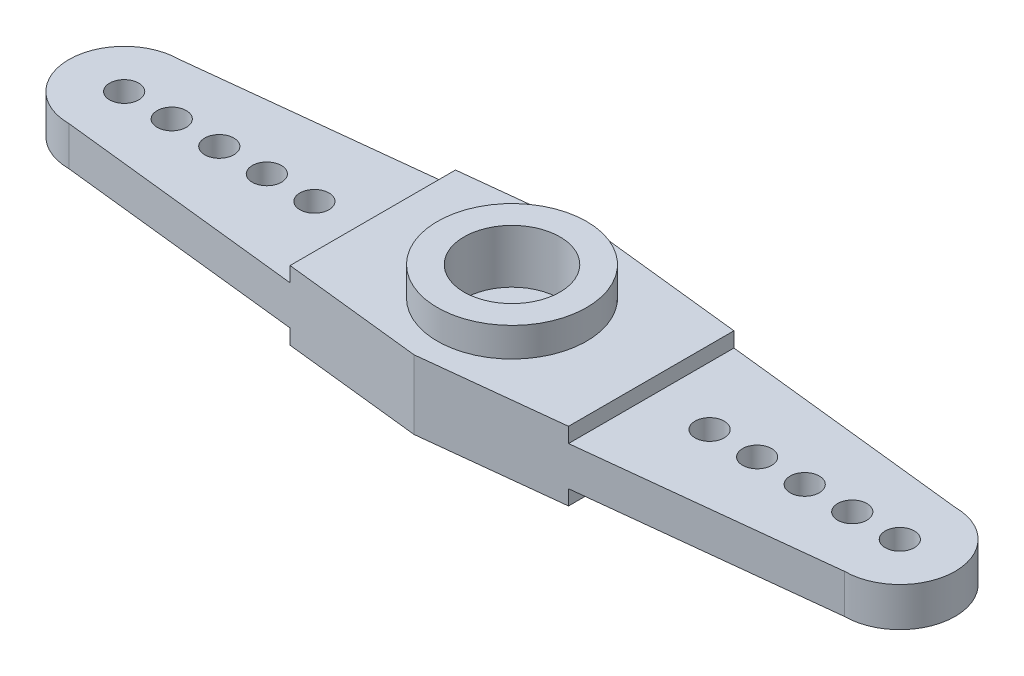
ISO-10303-21;
HEADER;
FILE_DESCRIPTION(('STEP AP214'),'2;1');
FILE_NAME('part.step','',(''),(''),'','','');
FILE_SCHEMA(('AUTOMOTIVE_DESIGN { 1 0 10303 214 1 1 1 1 }'));
ENDSEC;
DATA;
#1=APPLICATION_CONTEXT('core data for automotive mechanical design processes');
#2=APPLICATION_PROTOCOL_DEFINITION('international standard','automotive_design',2000,#1);
#3=PRODUCT_CONTEXT('',#1,'mechanical');
#4=PRODUCT('Part','Part','',(#3));
#5=PRODUCT_RELATED_PRODUCT_CATEGORY('part','',(#4));
#6=PRODUCT_DEFINITION_FORMATION('','',#4);
#7=PRODUCT_DEFINITION_CONTEXT('part definition',#1,'design');
#8=PRODUCT_DEFINITION('design','',#6,#7);
#9=PRODUCT_DEFINITION_SHAPE('','',#8);
#10=(LENGTH_UNIT() NAMED_UNIT(*) SI_UNIT(.MILLI.,.METRE.));
#11=(NAMED_UNIT(*) PLANE_ANGLE_UNIT() SI_UNIT($,.RADIAN.));
#12=(NAMED_UNIT(*) SI_UNIT($,.STERADIAN.) SOLID_ANGLE_UNIT());
#13=UNCERTAINTY_MEASURE_WITH_UNIT(LENGTH_MEASURE(1.E-05),#10,'distance_accuracy_value','');
#14=(GEOMETRIC_REPRESENTATION_CONTEXT(3) GLOBAL_UNCERTAINTY_ASSIGNED_CONTEXT((#13)) GLOBAL_UNIT_ASSIGNED_CONTEXT((#10,
#11,#12)) REPRESENTATION_CONTEXT('',''));
#15=CARTESIAN_POINT('',(0.,0.,0.));
#16=DIRECTION('',(0.,0.,1.));
#17=DIRECTION('',(1.,0.,0.));
#18=AXIS2_PLACEMENT_3D('',#15,#16,#17);
#19=CARTESIAN_POINT('',(25.28,2.55,-6.39));
#20=DIRECTION('',(0.,1.,0.));
#21=DIRECTION('',(0.,0.,1.));
#22=AXIS2_PLACEMENT_3D('',#19,#20,#21);
#23=PLANE('',#22);
#24=DIRECTION('',(0.,0.,-1.));
#25=VECTOR('',#24,1.);
#26=CARTESIAN_POINT('',(9.07500000000001,2.55,-6.38999999999999));
#27=LINE('',#26,#25);
#28=CARTESIAN_POINT('',(9.07500000000001,2.55,-0.997962816455698));
#29=VERTEX_POINT('',#28);
#30=CARTESIAN_POINT('',(9.075,2.55,-11.7820371835443));
#31=VERTEX_POINT('',#30);
#32=EDGE_CURVE('E206',#29,#31,#27,.T.);
#33=ORIENTED_EDGE('',*,*,#32,.F.);
#34=DIRECTION('',(0.99400777423587,0.,-0.109309399223723));
#35=VECTOR('',#34,1.);
#36=CARTESIAN_POINT('',(0.,2.55,0.));
#37=LINE('',#36,#35);
#38=CARTESIAN_POINT('',(25.28,2.55,-2.78));
#39=VERTEX_POINT('',#38);
#40=EDGE_CURVE('E282',#29,#39,#37,.T.);
#41=ORIENTED_EDGE('',*,*,#40,.T.);
#42=CARTESIAN_POINT('',(25.28,2.55,-6.39));
#43=DIRECTION('',(0.,1.,0.));
#44=DIRECTION('',(0.,0.,1.));
#45=AXIS2_PLACEMENT_3D('',#42,#43,#44);
#46=CIRCLE('',#45,3.61);
#47=CARTESIAN_POINT('',(25.28,2.55,-10.));
#48=VERTEX_POINT('',#47);
#49=EDGE_CURVE('E273',#39,#48,#46,.T.);
#50=ORIENTED_EDGE('',*,*,#49,.T.);
#51=DIRECTION('',(-0.99400777423587,0.,-0.109309399223723));
#52=VECTOR('',#51,1.);
#53=CARTESIAN_POINT('',(0.,2.55,-12.78));
#54=LINE('',#53,#52);
#55=EDGE_CURVE('E50',#48,#31,#54,.T.);
#56=ORIENTED_EDGE('',*,*,#55,.T.);
#57=EDGE_LOOP('',(#33,#41,#50,#56));
#58=FACE_BOUND('',#57,.T.);
#59=CARTESIAN_POINT('',(12.88,2.55,-6.38999999999991));
#60=DIRECTION('',(0.,1.,0.));
#61=DIRECTION('',(0.,0.,1.));
#62=AXIS2_PLACEMENT_3D('',#59,#60,#61);
#63=CIRCLE('',#62,0.949999999999999);
#64=CARTESIAN_POINT('',(12.88,2.55,-5.43999999999992));
#65=VERTEX_POINT('',#64);
#66=EDGE_CURVE('E237',#65,#65,#63,.T.);
#67=ORIENTED_EDGE('',*,*,#66,.F.);
#68=EDGE_LOOP('',(#67));
#69=FACE_BOUND('',#68,.T.);
#70=CARTESIAN_POINT('',(19.08,2.55,-6.38999999999996));
#71=DIRECTION('',(0.,1.,0.));
#72=DIRECTION('',(0.,0.,1.));
#73=AXIS2_PLACEMENT_3D('',#70,#71,#72);
#74=CIRCLE('',#73,0.950000000000001);
#75=CARTESIAN_POINT('',(19.08,2.55,-5.43999999999996));
#76=VERTEX_POINT('',#75);
#77=EDGE_CURVE('E249',#76,#76,#74,.T.);
#78=ORIENTED_EDGE('',*,*,#77,.F.);
#79=EDGE_LOOP('',(#78));
#80=FACE_BOUND('',#79,.T.);
#81=CARTESIAN_POINT('',(25.28,2.55,-6.39));
#82=DIRECTION('',(0.,1.,0.));
#83=DIRECTION('',(0.,0.,1.));
#84=AXIS2_PLACEMENT_3D('',#81,#82,#83);
#85=CIRCLE('',#84,0.950000000000001);
#86=CARTESIAN_POINT('',(25.28,2.55,-5.44));
#87=VERTEX_POINT('',#86);
#88=EDGE_CURVE('E267',#87,#87,#85,.T.);
#89=ORIENTED_EDGE('',*,*,#88,.F.);
#90=EDGE_LOOP('',(#89));
#91=FACE_BOUND('',#90,.T.);
#92=CARTESIAN_POINT('',(22.18,2.55,-6.38999999999998));
#93=DIRECTION('',(0.,1.,0.));
#94=DIRECTION('',(0.,0.,1.));
#95=AXIS2_PLACEMENT_3D('',#92,#93,#94);
#96=CIRCLE('',#95,0.950000000000001);
#97=CARTESIAN_POINT('',(22.18,2.55,-5.43999999999998));
#98=VERTEX_POINT('',#97);
#99=EDGE_CURVE('E255',#98,#98,#96,.T.);
#100=ORIENTED_EDGE('',*,*,#99,.F.);
#101=EDGE_LOOP('',(#100));
#102=FACE_BOUND('',#101,.T.);
#103=CARTESIAN_POINT('',(15.98,2.55,-6.38999999999994));
#104=DIRECTION('',(0.,1.,0.));
#105=DIRECTION('',(0.,0.,1.));
#106=AXIS2_PLACEMENT_3D('',#103,#104,#105);
#107=CIRCLE('',#106,0.950000000000001);
#108=CARTESIAN_POINT('',(15.98,2.55,-5.43999999999994));
#109=VERTEX_POINT('',#108);
#110=EDGE_CURVE('E243',#109,#109,#107,.T.);
#111=ORIENTED_EDGE('',*,*,#110,.F.);
#112=EDGE_LOOP('',(#111));
#113=FACE_BOUND('',#112,.T.);
#114=ADVANCED_FACE('F34',(#58,#69,#80,#91,#102,#113),#23,.T.);
#115=CARTESIAN_POINT('',(25.28,0.,-6.39));
#116=DIRECTION('',(0.,1.,0.));
#117=DIRECTION('',(0.,0.,1.));
#118=AXIS2_PLACEMENT_3D('',#115,#116,#117);
#119=PLANE('',#118);
#120=CARTESIAN_POINT('',(12.88,0.,-6.38999999999991));
#121=DIRECTION('',(0.,1.,0.));
#122=DIRECTION('',(0.,0.,1.));
#123=AXIS2_PLACEMENT_3D('',#120,#121,#122);
#124=CIRCLE('',#123,0.949999999999999);
#125=CARTESIAN_POINT('',(12.88,0.,-5.43999999999992));
#126=VERTEX_POINT('',#125);
#127=EDGE_CURVE('E234',#126,#126,#124,.T.);
#128=ORIENTED_EDGE('',*,*,#127,.T.);
#129=EDGE_LOOP('',(#128));
#130=FACE_BOUND('',#129,.T.);
#131=CARTESIAN_POINT('',(15.98,0.,-6.38999999999994));
#132=DIRECTION('',(0.,1.,0.));
#133=DIRECTION('',(0.,0.,1.));
#134=AXIS2_PLACEMENT_3D('',#131,#132,#133);
#135=CIRCLE('',#134,0.950000000000001);
#136=CARTESIAN_POINT('',(15.98,0.,-5.43999999999994));
#137=VERTEX_POINT('',#136);
#138=EDGE_CURVE('E240',#137,#137,#135,.T.);
#139=ORIENTED_EDGE('',*,*,#138,.T.);
#140=EDGE_LOOP('',(#139));
#141=FACE_BOUND('',#140,.T.);
#142=CARTESIAN_POINT('',(19.08,0.,-6.38999999999996));
#143=DIRECTION('',(0.,1.,0.));
#144=DIRECTION('',(0.,0.,1.));
#145=AXIS2_PLACEMENT_3D('',#142,#143,#144);
#146=CIRCLE('',#145,0.950000000000001);
#147=CARTESIAN_POINT('',(19.08,0.,-5.43999999999996));
#148=VERTEX_POINT('',#147);
#149=EDGE_CURVE('E246',#148,#148,#146,.T.);
#150=ORIENTED_EDGE('',*,*,#149,.T.);
#151=EDGE_LOOP('',(#150));
#152=FACE_BOUND('',#151,.T.);
#153=CARTESIAN_POINT('',(22.18,0.,-6.38999999999998));
#154=DIRECTION('',(0.,1.,0.));
#155=DIRECTION('',(0.,0.,1.));
#156=AXIS2_PLACEMENT_3D('',#153,#154,#155);
#157=CIRCLE('',#156,0.950000000000001);
#158=CARTESIAN_POINT('',(22.18,0.,-5.43999999999998));
#159=VERTEX_POINT('',#158);
#160=EDGE_CURVE('E252',#159,#159,#157,.T.);
#161=ORIENTED_EDGE('',*,*,#160,.T.);
#162=EDGE_LOOP('',(#161));
#163=FACE_BOUND('',#162,.T.);
#164=CARTESIAN_POINT('',(25.28,0.,-6.39));
#165=DIRECTION('',(0.,1.,0.));
#166=DIRECTION('',(0.,0.,1.));
#167=AXIS2_PLACEMENT_3D('',#164,#165,#166);
#168=CIRCLE('',#167,0.950000000000001);
#169=CARTESIAN_POINT('',(25.28,0.,-5.44));
#170=VERTEX_POINT('',#169);
#171=EDGE_CURVE('E264',#170,#170,#168,.T.);
#172=ORIENTED_EDGE('',*,*,#171,.T.);
#173=EDGE_LOOP('',(#172));
#174=FACE_BOUND('',#173,.T.);
#175=DIRECTION('',(0.99400777423587,0.,-0.109309399223723));
#176=VECTOR('',#175,1.);
#177=CARTESIAN_POINT('',(0.,0.,0.));
#178=LINE('',#177,#176);
#179=CARTESIAN_POINT('',(9.07500000000001,0.,-0.997962816455698));
#180=VERTEX_POINT('',#179);
#181=CARTESIAN_POINT('',(25.28,0.,-2.78));
#182=VERTEX_POINT('',#181);
#183=EDGE_CURVE('E275',#180,#182,#178,.T.);
#184=ORIENTED_EDGE('',*,*,#183,.F.);
#185=DIRECTION('',(0.,0.,-1.));
#186=VECTOR('',#185,1.);
#187=CARTESIAN_POINT('',(9.07500000000001,0.,-6.38999999999999));
#188=LINE('',#187,#186);
#189=CARTESIAN_POINT('',(9.075,0.,-11.7820371835443));
#190=VERTEX_POINT('',#189);
#191=EDGE_CURVE('E195',#180,#190,#188,.T.);
#192=ORIENTED_EDGE('',*,*,#191,.T.);
#193=DIRECTION('',(-0.99400777423587,0.,-0.109309399223723));
#194=VECTOR('',#193,1.);
#195=CARTESIAN_POINT('',(0.,0.,-12.78));
#196=LINE('',#195,#194);
#197=CARTESIAN_POINT('',(25.28,0.,-10.));
#198=VERTEX_POINT('',#197);
#199=EDGE_CURVE('E287',#198,#190,#196,.T.);
#200=ORIENTED_EDGE('',*,*,#199,.F.);
#201=CARTESIAN_POINT('',(25.28,0.,-6.39));
#202=DIRECTION('',(0.,1.,0.));
#203=DIRECTION('',(0.,0.,1.));
#204=AXIS2_PLACEMENT_3D('',#201,#202,#203);
#205=CIRCLE('',#204,3.61);
#206=EDGE_CURVE('E270',#182,#198,#205,.T.);
#207=ORIENTED_EDGE('',*,*,#206,.F.);
#208=EDGE_LOOP('',(#184,#192,#200,#207));
#209=FACE_BOUND('',#208,.T.);
#210=ADVANCED_FACE('F320',(#130,#141,#152,#163,#174,#209),#119,.F.);
#211=DIRECTION('',(0.,0.,1.));
#212=VECTOR('',#211,1.);
#213=CARTESIAN_POINT('',(-9.07499999999999,2.55,-6.39000000000002));
#214=LINE('',#213,#212);
#215=CARTESIAN_POINT('',(-9.07499999999999,2.55,-11.7820371835443));
#216=VERTEX_POINT('',#215);
#217=CARTESIAN_POINT('',(-9.075,2.55,-0.997962816455696));
#218=VERTEX_POINT('',#217);
#219=EDGE_CURVE('E58',#216,#218,#214,.T.);
#220=ORIENTED_EDGE('',*,*,#219,.F.);
#221=DIRECTION('',(-0.99400777423587,0.,0.109309399223723));
#222=VECTOR('',#221,1.);
#223=CARTESIAN_POINT('',(0.,2.55,-12.78));
#224=LINE('',#223,#222);
#225=CARTESIAN_POINT('',(-25.28,2.55,-9.99999999999999));
#226=VERTEX_POINT('',#225);
#227=EDGE_CURVE('E142',#216,#226,#224,.T.);
#228=ORIENTED_EDGE('',*,*,#227,.T.);
#229=CARTESIAN_POINT('',(-25.28,2.55,-6.39));
#230=DIRECTION('',(0.,1.,0.));
#231=DIRECTION('',(0.,0.,-1.));
#232=AXIS2_PLACEMENT_3D('',#229,#230,#231);
#233=CIRCLE('',#232,3.61);
#234=CARTESIAN_POINT('',(-25.28,2.55,-2.78));
#235=VERTEX_POINT('',#234);
#236=EDGE_CURVE('E278',#226,#235,#233,.T.);
#237=ORIENTED_EDGE('',*,*,#236,.T.);
#238=DIRECTION('',(0.99400777423587,0.,0.109309399223723));
#239=VECTOR('',#238,1.);
#240=CARTESIAN_POINT('',(0.,2.55,0.));
#241=LINE('',#240,#239);
#242=EDGE_CURVE('E280',#235,#218,#241,.T.);
#243=ORIENTED_EDGE('',*,*,#242,.T.);
#244=EDGE_LOOP('',(#220,#228,#237,#243));
#245=FACE_BOUND('',#244,.T.);
#246=CARTESIAN_POINT('',(-22.18,2.55,-6.38999999999998));
#247=DIRECTION('',(0.,1.,0.));
#248=DIRECTION('',(0.,0.,-1.));
#249=AXIS2_PLACEMENT_3D('',#246,#247,#248);
#250=CIRCLE('',#249,0.950000000000001);
#251=CARTESIAN_POINT('',(-22.18,2.55,-7.33999999999998));
#252=VERTEX_POINT('',#251);
#253=EDGE_CURVE('E219',#252,#252,#250,.T.);
#254=ORIENTED_EDGE('',*,*,#253,.F.);
#255=EDGE_LOOP('',(#254));
#256=FACE_BOUND('',#255,.T.);
#257=CARTESIAN_POINT('',(-15.98,2.55,-6.38999999999993));
#258=DIRECTION('',(0.,1.,0.));
#259=DIRECTION('',(0.,0.,-1.));
#260=AXIS2_PLACEMENT_3D('',#257,#258,#259);
#261=CIRCLE('',#260,0.950000000000001);
#262=CARTESIAN_POINT('',(-15.98,2.55,-7.33999999999993));
#263=VERTEX_POINT('',#262);
#264=EDGE_CURVE('E231',#263,#263,#261,.T.);
#265=ORIENTED_EDGE('',*,*,#264,.F.);
#266=EDGE_LOOP('',(#265));
#267=FACE_BOUND('',#266,.T.);
#268=CARTESIAN_POINT('',(-12.88,2.55,-6.38999999999991));
#269=DIRECTION('',(0.,1.,0.));
#270=DIRECTION('',(0.,0.,-1.));
#271=AXIS2_PLACEMENT_3D('',#268,#269,#270);
#272=CIRCLE('',#271,0.949999999999999);
#273=CARTESIAN_POINT('',(-12.88,2.55,-7.33999999999991));
#274=VERTEX_POINT('',#273);
#275=EDGE_CURVE('E261',#274,#274,#272,.T.);
#276=ORIENTED_EDGE('',*,*,#275,.F.);
#277=EDGE_LOOP('',(#276));
#278=FACE_BOUND('',#277,.T.);
#279=CARTESIAN_POINT('',(-19.08,2.55,-6.38999999999995));
#280=DIRECTION('',(0.,1.,0.));
#281=DIRECTION('',(0.,0.,-1.));
#282=AXIS2_PLACEMENT_3D('',#279,#280,#281);
#283=CIRCLE('',#282,0.950000000000001);
#284=CARTESIAN_POINT('',(-19.08,2.55,-7.33999999999996));
#285=VERTEX_POINT('',#284);
#286=EDGE_CURVE('E225',#285,#285,#283,.T.);
#287=ORIENTED_EDGE('',*,*,#286,.F.);
#288=EDGE_LOOP('',(#287));
#289=FACE_BOUND('',#288,.T.);
#290=CARTESIAN_POINT('',(-25.28,2.55,-6.39));
#291=DIRECTION('',(0.,1.,0.));
#292=DIRECTION('',(0.,0.,-1.));
#293=AXIS2_PLACEMENT_3D('',#290,#291,#292);
#294=CIRCLE('',#293,0.950000000000001);
#295=CARTESIAN_POINT('',(-25.28,2.55,-7.34));
#296=VERTEX_POINT('',#295);
#297=EDGE_CURVE('E213',#296,#296,#294,.T.);
#298=ORIENTED_EDGE('',*,*,#297,.F.);
#299=EDGE_LOOP('',(#298));
#300=FACE_BOUND('',#299,.T.);
#301=ADVANCED_FACE('F349',(#245,#256,#267,#278,#289,#300),#23,.T.);
#302=DIRECTION('',(-0.99400777423587,0.,0.109309399223723));
#303=VECTOR('',#302,1.);
#304=CARTESIAN_POINT('',(0.,0.,-12.78));
#305=LINE('',#304,#303);
#306=CARTESIAN_POINT('',(-9.07499999999999,0.,-11.7820371835443));
#307=VERTEX_POINT('',#306);
#308=CARTESIAN_POINT('',(-25.28,0.,-9.99999999999999));
#309=VERTEX_POINT('',#308);
#310=EDGE_CURVE('E290',#307,#309,#305,.T.);
#311=ORIENTED_EDGE('',*,*,#310,.F.);
#312=DIRECTION('',(0.,0.,1.));
#313=VECTOR('',#312,1.);
#314=CARTESIAN_POINT('',(-9.07499999999999,0.,-6.39000000000002));
#315=LINE('',#314,#313);
#316=CARTESIAN_POINT('',(-9.075,0.,-0.997962816455696));
#317=VERTEX_POINT('',#316);
#318=EDGE_CURVE('E208',#307,#317,#315,.T.);
#319=ORIENTED_EDGE('',*,*,#318,.T.);
#320=DIRECTION('',(0.99400777423587,0.,0.109309399223723));
#321=VECTOR('',#320,1.);
#322=CARTESIAN_POINT('',(0.,0.,0.));
#323=LINE('',#322,#321);
#324=CARTESIAN_POINT('',(-25.28,0.,-2.78));
#325=VERTEX_POINT('',#324);
#326=EDGE_CURVE('E294',#325,#317,#323,.T.);
#327=ORIENTED_EDGE('',*,*,#326,.F.);
#328=CARTESIAN_POINT('',(-25.28,0.,-6.39));
#329=DIRECTION('',(0.,1.,0.));
#330=DIRECTION('',(0.,0.,-1.));
#331=AXIS2_PLACEMENT_3D('',#328,#329,#330);
#332=CIRCLE('',#331,3.61);
#333=EDGE_CURVE('E292',#309,#325,#332,.T.);
#334=ORIENTED_EDGE('',*,*,#333,.F.);
#335=EDGE_LOOP('',(#311,#319,#327,#334));
#336=FACE_BOUND('',#335,.T.);
#337=CARTESIAN_POINT('',(-12.88,0.,-6.38999999999991));
#338=DIRECTION('',(0.,1.,0.));
#339=DIRECTION('',(0.,0.,-1.));
#340=AXIS2_PLACEMENT_3D('',#337,#338,#339);
#341=CIRCLE('',#340,0.949999999999999);
#342=CARTESIAN_POINT('',(-12.88,0.,-7.33999999999991));
#343=VERTEX_POINT('',#342);
#344=EDGE_CURVE('E258',#343,#343,#341,.T.);
#345=ORIENTED_EDGE('',*,*,#344,.T.);
#346=EDGE_LOOP('',(#345));
#347=FACE_BOUND('',#346,.T.);
#348=CARTESIAN_POINT('',(-15.98,0.,-6.38999999999993));
#349=DIRECTION('',(0.,1.,0.));
#350=DIRECTION('',(0.,0.,-1.));
#351=AXIS2_PLACEMENT_3D('',#348,#349,#350);
#352=CIRCLE('',#351,0.950000000000001);
#353=CARTESIAN_POINT('',(-15.98,0.,-7.33999999999993));
#354=VERTEX_POINT('',#353);
#355=EDGE_CURVE('E228',#354,#354,#352,.T.);
#356=ORIENTED_EDGE('',*,*,#355,.T.);
#357=EDGE_LOOP('',(#356));
#358=FACE_BOUND('',#357,.T.);
#359=CARTESIAN_POINT('',(-19.08,0.,-6.38999999999995));
#360=DIRECTION('',(0.,1.,0.));
#361=DIRECTION('',(0.,0.,-1.));
#362=AXIS2_PLACEMENT_3D('',#359,#360,#361);
#363=CIRCLE('',#362,0.950000000000001);
#364=CARTESIAN_POINT('',(-19.08,0.,-7.33999999999996));
#365=VERTEX_POINT('',#364);
#366=EDGE_CURVE('E222',#365,#365,#363,.T.);
#367=ORIENTED_EDGE('',*,*,#366,.T.);
#368=EDGE_LOOP('',(#367));
#369=FACE_BOUND('',#368,.T.);
#370=CARTESIAN_POINT('',(-22.18,0.,-6.38999999999998));
#371=DIRECTION('',(0.,1.,0.));
#372=DIRECTION('',(0.,0.,-1.));
#373=AXIS2_PLACEMENT_3D('',#370,#371,#372);
#374=CIRCLE('',#373,0.950000000000001);
#375=CARTESIAN_POINT('',(-22.18,0.,-7.33999999999998));
#376=VERTEX_POINT('',#375);
#377=EDGE_CURVE('E216',#376,#376,#374,.T.);
#378=ORIENTED_EDGE('',*,*,#377,.T.);
#379=EDGE_LOOP('',(#378));
#380=FACE_BOUND('',#379,.T.);
#381=CARTESIAN_POINT('',(-25.28,0.,-6.39));
#382=DIRECTION('',(0.,1.,0.));
#383=DIRECTION('',(0.,0.,-1.));
#384=AXIS2_PLACEMENT_3D('',#381,#382,#383);
#385=CIRCLE('',#384,0.950000000000001);
#386=CARTESIAN_POINT('',(-25.28,0.,-7.34));
#387=VERTEX_POINT('',#386);
#388=EDGE_CURVE('E212',#387,#387,#385,.T.);
#389=ORIENTED_EDGE('',*,*,#388,.T.);
#390=EDGE_LOOP('',(#389));
#391=FACE_BOUND('',#390,.T.);
#392=ADVANCED_FACE('F341',(#336,#347,#358,#369,#380,#391),#119,.F.);
#393=CARTESIAN_POINT('',(25.28,2.55,-6.39));
#394=DIRECTION('',(0.,-1.,0.));
#395=DIRECTION('',(0.,0.,-1.));
#396=AXIS2_PLACEMENT_3D('',#393,#394,#395);
#397=CYLINDRICAL_SURFACE('',#396,3.61);
#398=ORIENTED_EDGE('',*,*,#206,.T.);
#399=DIRECTION('',(0.,-1.,0.));
#400=VECTOR('',#399,1.);
#401=CARTESIAN_POINT('',(25.28,2.55,-10.));
#402=LINE('',#401,#400);
#403=EDGE_CURVE('E38',#48,#198,#402,.T.);
#404=ORIENTED_EDGE('',*,*,#403,.F.);
#405=ORIENTED_EDGE('',*,*,#49,.F.);
#406=DIRECTION('',(0.,-1.,0.));
#407=VECTOR('',#406,1.);
#408=CARTESIAN_POINT('',(25.28,2.55,-2.78));
#409=LINE('',#408,#407);
#410=EDGE_CURVE('E284',#39,#182,#409,.T.);
#411=ORIENTED_EDGE('',*,*,#410,.T.);
#412=EDGE_LOOP('',(#398,#404,#405,#411));
#413=FACE_BOUND('',#412,.T.);
#414=ADVANCED_FACE('F36',(#413),#397,.T.);
#415=CARTESIAN_POINT('',(0.,2.55,-12.78));
#416=DIRECTION('',(-0.109309399223723,0.,0.99400777423587));
#417=DIRECTION('',(0.99400777423587,0.,0.109309399223723));
#418=AXIS2_PLACEMENT_3D('',#415,#416,#417);
#419=PLANE('',#418);
#420=ORIENTED_EDGE('',*,*,#199,.T.);
#421=DIRECTION('',(0.,1.,0.));
#422=VECTOR('',#421,1.);
#423=CARTESIAN_POINT('',(9.075,-0.975,-11.7820371835443));
#424=LINE('',#423,#422);
#425=CARTESIAN_POINT('',(9.075,-0.975,-11.7820371835443));
#426=VERTEX_POINT('',#425);
#427=EDGE_CURVE('E193',#426,#190,#424,.T.);
#428=ORIENTED_EDGE('',*,*,#427,.F.);
#429=DIRECTION('',(-0.99400777423587,0.,-0.109309399223723));
#430=VECTOR('',#429,1.);
#431=CARTESIAN_POINT('',(0.,-0.975,-12.78));
#432=LINE('',#431,#430);
#433=CARTESIAN_POINT('',(0.,-0.975,-12.78));
#434=VERTEX_POINT('',#433);
#435=EDGE_CURVE('E145',#426,#434,#432,.T.);
#436=ORIENTED_EDGE('',*,*,#435,.T.);
#437=DIRECTION('',(0.,-1.,0.));
#438=VECTOR('',#437,1.);
#439=CARTESIAN_POINT('',(0.,2.55,-12.78));
#440=LINE('',#439,#438);
#441=CARTESIAN_POINT('',(0.,3.525,-12.78));
#442=VERTEX_POINT('',#441);
#443=EDGE_CURVE('E307',#442,#434,#440,.T.);
#444=ORIENTED_EDGE('',*,*,#443,.F.);
#445=DIRECTION('',(-0.99400777423587,0.,-0.109309399223723));
#446=VECTOR('',#445,1.);
#447=CARTESIAN_POINT('',(0.,3.525,-12.78));
#448=LINE('',#447,#446);
#449=CARTESIAN_POINT('',(9.075,3.525,-11.7820371835443));
#450=VERTEX_POINT('',#449);
#451=EDGE_CURVE('E161',#450,#442,#448,.T.);
#452=ORIENTED_EDGE('',*,*,#451,.F.);
#453=EDGE_CURVE('E196',#31,#450,#424,.T.);
#454=ORIENTED_EDGE('',*,*,#453,.F.);
#455=ORIENTED_EDGE('',*,*,#55,.F.);
#456=ORIENTED_EDGE('',*,*,#403,.T.);
#457=EDGE_LOOP('',(#420,#428,#436,#444,#452,#454,#455,#456));
#458=FACE_BOUND('',#457,.T.);
#459=ADVANCED_FACE('F312',(#458),#419,.F.);
#460=CARTESIAN_POINT('',(0.,2.55,-12.78));
#461=DIRECTION('',(0.109309399223723,0.,0.99400777423587));
#462=DIRECTION('',(0.99400777423587,0.,-0.109309399223723));
#463=AXIS2_PLACEMENT_3D('',#460,#461,#462);
#464=PLANE('',#463);
#465=ORIENTED_EDGE('',*,*,#227,.F.);
#466=DIRECTION('',(0.,1.,0.));
#467=VECTOR('',#466,1.);
#468=CARTESIAN_POINT('',(-9.07499999999999,-0.975,-11.7820371835443));
#469=LINE('',#468,#467);
#470=CARTESIAN_POINT('',(-9.07499999999999,3.525,-11.7820371835443));
#471=VERTEX_POINT('',#470);
#472=EDGE_CURVE('E136',#216,#471,#469,.T.);
#473=ORIENTED_EDGE('',*,*,#472,.T.);
#474=DIRECTION('',(-0.99400777423587,0.,0.109309399223723));
#475=VECTOR('',#474,1.);
#476=CARTESIAN_POINT('',(-9.07499999999999,3.525,-11.7820371835443));
#477=LINE('',#476,#475);
#478=EDGE_CURVE('E140',#442,#471,#477,.T.);
#479=ORIENTED_EDGE('',*,*,#478,.F.);
#480=ORIENTED_EDGE('',*,*,#443,.T.);
#481=DIRECTION('',(-0.99400777423587,0.,0.109309399223723));
#482=VECTOR('',#481,1.);
#483=CARTESIAN_POINT('',(-9.07499999999999,-0.975,-11.7820371835443));
#484=LINE('',#483,#482);
#485=CARTESIAN_POINT('',(-9.07499999999999,-0.975,-11.7820371835443));
#486=VERTEX_POINT('',#485);
#487=EDGE_CURVE('E176',#434,#486,#484,.T.);
#488=ORIENTED_EDGE('',*,*,#487,.T.);
#489=EDGE_CURVE('E144',#486,#307,#469,.T.);
#490=ORIENTED_EDGE('',*,*,#489,.T.);
#491=ORIENTED_EDGE('',*,*,#310,.T.);
#492=DIRECTION('',(0.,-1.,0.));
#493=VECTOR('',#492,1.);
#494=CARTESIAN_POINT('',(-25.28,2.55,-9.99999999999999));
#495=LINE('',#494,#493);
#496=EDGE_CURVE('E305',#226,#309,#495,.T.);
#497=ORIENTED_EDGE('',*,*,#496,.F.);
#498=EDGE_LOOP('',(#465,#473,#479,#480,#488,#490,#491,#497));
#499=FACE_BOUND('',#498,.T.);
#500=ADVANCED_FACE('F138',(#499),#464,.F.);
#501=CARTESIAN_POINT('',(-25.28,2.55,-6.39));
#502=DIRECTION('',(0.,-1.,0.));
#503=DIRECTION('',(0.,0.,-1.));
#504=AXIS2_PLACEMENT_3D('',#501,#502,#503);
#505=CYLINDRICAL_SURFACE('',#504,3.61);
#506=ORIENTED_EDGE('',*,*,#333,.T.);
#507=DIRECTION('',(0.,-1.,0.));
#508=VECTOR('',#507,1.);
#509=CARTESIAN_POINT('',(-25.28,2.55,-2.78));
#510=LINE('',#509,#508);
#511=EDGE_CURVE('E302',#235,#325,#510,.T.);
#512=ORIENTED_EDGE('',*,*,#511,.F.);
#513=ORIENTED_EDGE('',*,*,#236,.F.);
#514=ORIENTED_EDGE('',*,*,#496,.T.);
#515=EDGE_LOOP('',(#506,#512,#513,#514));
#516=FACE_BOUND('',#515,.T.);
#517=ADVANCED_FACE('F346',(#516),#505,.T.);
#518=CARTESIAN_POINT('',(0.,2.55,0.));
#519=DIRECTION('',(0.109309399223723,0.,-0.99400777423587));
#520=DIRECTION('',(-0.99400777423587,0.,-0.109309399223723));
#521=AXIS2_PLACEMENT_3D('',#518,#519,#520);
#522=PLANE('',#521);
#523=ORIENTED_EDGE('',*,*,#326,.T.);
#524=DIRECTION('',(0.,1.,0.));
#525=VECTOR('',#524,1.);
#526=CARTESIAN_POINT('',(-9.075,-0.975,-0.997962816455696));
#527=LINE('',#526,#525);
#528=CARTESIAN_POINT('',(-9.075,-0.975,-0.997962816455696));
#529=VERTEX_POINT('',#528);
#530=EDGE_CURVE('E201',#529,#317,#527,.T.);
#531=ORIENTED_EDGE('',*,*,#530,.F.);
#532=DIRECTION('',(0.99400777423587,0.,0.109309399223723));
#533=VECTOR('',#532,1.);
#534=CARTESIAN_POINT('',(-9.075,-0.975,-0.997962816455696));
#535=LINE('',#534,#533);
#536=CARTESIAN_POINT('',(0.,-0.975,0.));
#537=VERTEX_POINT('',#536);
#538=EDGE_CURVE('E182',#529,#537,#535,.T.);
#539=ORIENTED_EDGE('',*,*,#538,.T.);
#540=DIRECTION('',(0.,-1.,0.));
#541=VECTOR('',#540,1.);
#542=CARTESIAN_POINT('',(0.,2.55,0.));
#543=LINE('',#542,#541);
#544=CARTESIAN_POINT('',(0.,3.525,0.));
#545=VERTEX_POINT('',#544);
#546=EDGE_CURVE('E300',#545,#537,#543,.T.);
#547=ORIENTED_EDGE('',*,*,#546,.F.);
#548=DIRECTION('',(0.99400777423587,0.,0.109309399223723));
#549=VECTOR('',#548,1.);
#550=CARTESIAN_POINT('',(-9.075,3.525,-0.997962816455696));
#551=LINE('',#550,#549);
#552=CARTESIAN_POINT('',(-9.075,3.525,-0.997962816455696));
#553=VERTEX_POINT('',#552);
#554=EDGE_CURVE('E155',#553,#545,#551,.T.);
#555=ORIENTED_EDGE('',*,*,#554,.F.);
#556=EDGE_CURVE('E151',#218,#553,#527,.T.);
#557=ORIENTED_EDGE('',*,*,#556,.F.);
#558=ORIENTED_EDGE('',*,*,#242,.F.);
#559=ORIENTED_EDGE('',*,*,#511,.T.);
#560=EDGE_LOOP('',(#523,#531,#539,#547,#555,#557,#558,#559));
#561=FACE_BOUND('',#560,.T.);
#562=ADVANCED_FACE('F335',(#561),#522,.F.);
#563=CARTESIAN_POINT('',(0.,2.55,0.));
#564=DIRECTION('',(-0.109309399223723,0.,-0.99400777423587));
#565=DIRECTION('',(-0.99400777423587,0.,0.109309399223723));
#566=AXIS2_PLACEMENT_3D('',#563,#564,#565);
#567=PLANE('',#566);
#568=ORIENTED_EDGE('',*,*,#40,.F.);
#569=DIRECTION('',(0.,1.,0.));
#570=VECTOR('',#569,1.);
#571=CARTESIAN_POINT('',(9.07500000000001,-0.975,-0.997962816455698));
#572=LINE('',#571,#570);
#573=CARTESIAN_POINT('',(9.07500000000001,3.525,-0.997962816455698));
#574=VERTEX_POINT('',#573);
#575=EDGE_CURVE('E200',#29,#574,#572,.T.);
#576=ORIENTED_EDGE('',*,*,#575,.T.);
#577=DIRECTION('',(0.99400777423587,0.,-0.109309399223723));
#578=VECTOR('',#577,1.);
#579=CARTESIAN_POINT('',(0.,3.525,0.));
#580=LINE('',#579,#578);
#581=EDGE_CURVE('E170',#545,#574,#580,.T.);
#582=ORIENTED_EDGE('',*,*,#581,.F.);
#583=ORIENTED_EDGE('',*,*,#546,.T.);
#584=DIRECTION('',(0.99400777423587,0.,-0.109309399223723));
#585=VECTOR('',#584,1.);
#586=CARTESIAN_POINT('',(0.,-0.975,0.));
#587=LINE('',#586,#585);
#588=CARTESIAN_POINT('',(9.07500000000001,-0.975,-0.997962816455698));
#589=VERTEX_POINT('',#588);
#590=EDGE_CURVE('E185',#537,#589,#587,.T.);
#591=ORIENTED_EDGE('',*,*,#590,.T.);
#592=EDGE_CURVE('E197',#589,#180,#572,.T.);
#593=ORIENTED_EDGE('',*,*,#592,.T.);
#594=ORIENTED_EDGE('',*,*,#183,.T.);
#595=ORIENTED_EDGE('',*,*,#410,.F.);
#596=EDGE_LOOP('',(#568,#576,#582,#583,#591,#593,#594,#595));
#597=FACE_BOUND('',#596,.T.);
#598=ADVANCED_FACE('F326',(#597),#567,.F.);
#599=CARTESIAN_POINT('',(25.28,2.55,-6.39));
#600=DIRECTION('',(0.,-1.,0.));
#601=DIRECTION('',(0.,0.,-1.));
#602=AXIS2_PLACEMENT_3D('',#599,#600,#601);
#603=CYLINDRICAL_SURFACE('',#602,0.950000000000001);
#604=ORIENTED_EDGE('',*,*,#88,.T.);
#605=EDGE_LOOP('',(#604));
#606=FACE_BOUND('',#605,.T.);
#607=ORIENTED_EDGE('',*,*,#171,.F.);
#608=EDGE_LOOP('',(#607));
#609=FACE_BOUND('',#608,.T.);
#610=ADVANCED_FACE('F386',(#606,#609),#603,.F.);
#611=CARTESIAN_POINT('',(-12.88,2.55,-6.38999999999991));
#612=DIRECTION('',(0.,-1.,0.));
#613=DIRECTION('',(0.,0.,-1.));
#614=AXIS2_PLACEMENT_3D('',#611,#612,#613);
#615=CYLINDRICAL_SURFACE('',#614,0.949999999999999);
#616=ORIENTED_EDGE('',*,*,#275,.T.);
#617=EDGE_LOOP('',(#616));
#618=FACE_BOUND('',#617,.T.);
#619=ORIENTED_EDGE('',*,*,#344,.F.);
#620=EDGE_LOOP('',(#619));
#621=FACE_BOUND('',#620,.T.);
#622=ADVANCED_FACE('F388',(#618,#621),#615,.F.);
#623=CARTESIAN_POINT('',(22.18,2.55,-6.38999999999998));
#624=DIRECTION('',(0.,-1.,0.));
#625=DIRECTION('',(0.,0.,-1.));
#626=AXIS2_PLACEMENT_3D('',#623,#624,#625);
#627=CYLINDRICAL_SURFACE('',#626,0.950000000000001);
#628=ORIENTED_EDGE('',*,*,#99,.T.);
#629=EDGE_LOOP('',(#628));
#630=FACE_BOUND('',#629,.T.);
#631=ORIENTED_EDGE('',*,*,#160,.F.);
#632=EDGE_LOOP('',(#631));
#633=FACE_BOUND('',#632,.T.);
#634=ADVANCED_FACE('F395',(#630,#633),#627,.F.);
#635=CARTESIAN_POINT('',(19.08,2.55,-6.38999999999996));
#636=DIRECTION('',(0.,-1.,0.));
#637=DIRECTION('',(0.,0.,-1.));
#638=AXIS2_PLACEMENT_3D('',#635,#636,#637);
#639=CYLINDRICAL_SURFACE('',#638,0.950000000000001);
#640=ORIENTED_EDGE('',*,*,#77,.T.);
#641=EDGE_LOOP('',(#640));
#642=FACE_BOUND('',#641,.T.);
#643=ORIENTED_EDGE('',*,*,#149,.F.);
#644=EDGE_LOOP('',(#643));
#645=FACE_BOUND('',#644,.T.);
#646=ADVANCED_FACE('F372',(#642,#645),#639,.F.);
#647=CARTESIAN_POINT('',(15.98,2.55,-6.38999999999994));
#648=DIRECTION('',(0.,-1.,0.));
#649=DIRECTION('',(0.,0.,-1.));
#650=AXIS2_PLACEMENT_3D('',#647,#648,#649);
#651=CYLINDRICAL_SURFACE('',#650,0.950000000000001);
#652=ORIENTED_EDGE('',*,*,#110,.T.);
#653=EDGE_LOOP('',(#652));
#654=FACE_BOUND('',#653,.T.);
#655=ORIENTED_EDGE('',*,*,#138,.F.);
#656=EDGE_LOOP('',(#655));
#657=FACE_BOUND('',#656,.T.);
#658=ADVANCED_FACE('F368',(#654,#657),#651,.F.);
#659=CARTESIAN_POINT('',(12.88,2.55,-6.38999999999991));
#660=DIRECTION('',(0.,-1.,0.));
#661=DIRECTION('',(0.,0.,-1.));
#662=AXIS2_PLACEMENT_3D('',#659,#660,#661);
#663=CYLINDRICAL_SURFACE('',#662,0.949999999999999);
#664=ORIENTED_EDGE('',*,*,#66,.T.);
#665=EDGE_LOOP('',(#664));
#666=FACE_BOUND('',#665,.T.);
#667=ORIENTED_EDGE('',*,*,#127,.F.);
#668=EDGE_LOOP('',(#667));
#669=FACE_BOUND('',#668,.T.);
#670=ADVANCED_FACE('F371',(#666,#669),#663,.F.);
#671=CARTESIAN_POINT('',(-15.98,2.55,-6.38999999999993));
#672=DIRECTION('',(0.,-1.,0.));
#673=DIRECTION('',(0.,0.,-1.));
#674=AXIS2_PLACEMENT_3D('',#671,#672,#673);
#675=CYLINDRICAL_SURFACE('',#674,0.950000000000001);
#676=ORIENTED_EDGE('',*,*,#264,.T.);
#677=EDGE_LOOP('',(#676));
#678=FACE_BOUND('',#677,.T.);
#679=ORIENTED_EDGE('',*,*,#355,.F.);
#680=EDGE_LOOP('',(#679));
#681=FACE_BOUND('',#680,.T.);
#682=ADVANCED_FACE('F463',(#678,#681),#675,.F.);
#683=CARTESIAN_POINT('',(-19.08,2.55,-6.38999999999995));
#684=DIRECTION('',(0.,-1.,0.));
#685=DIRECTION('',(0.,0.,-1.));
#686=AXIS2_PLACEMENT_3D('',#683,#684,#685);
#687=CYLINDRICAL_SURFACE('',#686,0.950000000000001);
#688=ORIENTED_EDGE('',*,*,#286,.T.);
#689=EDGE_LOOP('',(#688));
#690=FACE_BOUND('',#689,.T.);
#691=ORIENTED_EDGE('',*,*,#366,.F.);
#692=EDGE_LOOP('',(#691));
#693=FACE_BOUND('',#692,.T.);
#694=ADVANCED_FACE('F453',(#690,#693),#687,.F.);
#695=CARTESIAN_POINT('',(-22.18,2.55,-6.38999999999998));
#696=DIRECTION('',(0.,-1.,0.));
#697=DIRECTION('',(0.,0.,-1.));
#698=AXIS2_PLACEMENT_3D('',#695,#696,#697);
#699=CYLINDRICAL_SURFACE('',#698,0.950000000000001);
#700=ORIENTED_EDGE('',*,*,#253,.T.);
#701=EDGE_LOOP('',(#700));
#702=FACE_BOUND('',#701,.T.);
#703=ORIENTED_EDGE('',*,*,#377,.F.);
#704=EDGE_LOOP('',(#703));
#705=FACE_BOUND('',#704,.T.);
#706=ADVANCED_FACE('F442',(#702,#705),#699,.F.);
#707=CARTESIAN_POINT('',(-25.28,2.55,-6.39));
#708=DIRECTION('',(0.,-1.,0.));
#709=DIRECTION('',(0.,0.,-1.));
#710=AXIS2_PLACEMENT_3D('',#707,#708,#709);
#711=CYLINDRICAL_SURFACE('',#710,0.950000000000001);
#712=ORIENTED_EDGE('',*,*,#297,.T.);
#713=EDGE_LOOP('',(#712));
#714=FACE_BOUND('',#713,.T.);
#715=ORIENTED_EDGE('',*,*,#388,.F.);
#716=EDGE_LOOP('',(#715));
#717=FACE_BOUND('',#716,.T.);
#718=ADVANCED_FACE('F437',(#714,#717),#711,.F.);
#719=CARTESIAN_POINT('',(0.,-0.975000000000001,0.));
#720=DIRECTION('',(0.,-1.,0.));
#721=DIRECTION('',(0.,0.,-1.));
#722=AXIS2_PLACEMENT_3D('',#719,#720,#721);
#723=PLANE('',#722);
#724=CARTESIAN_POINT('',(0.,-0.975000000000001,-6.39));
#725=DIRECTION('',(0.,-1.,0.));
#726=DIRECTION('',(0.,0.,-1.));
#727=AXIS2_PLACEMENT_3D('',#724,#725,#726);
#728=CIRCLE('',#727,4.135);
#729=CARTESIAN_POINT('',(0.,-0.975000000000001,-10.525));
#730=VERTEX_POINT('',#729);
#731=EDGE_CURVE('E165',#730,#730,#728,.T.);
#732=ORIENTED_EDGE('',*,*,#731,.F.);
#733=EDGE_LOOP('',(#732));
#734=FACE_BOUND('',#733,.T.);
#735=ORIENTED_EDGE('',*,*,#487,.F.);
#736=ORIENTED_EDGE('',*,*,#435,.F.);
#737=DIRECTION('',(0.,0.,-1.));
#738=VECTOR('',#737,1.);
#739=CARTESIAN_POINT('',(9.075,-0.975,-11.7820371835443));
#740=LINE('',#739,#738);
#741=EDGE_CURVE('E188',#589,#426,#740,.T.);
#742=ORIENTED_EDGE('',*,*,#741,.F.);
#743=ORIENTED_EDGE('',*,*,#590,.F.);
#744=ORIENTED_EDGE('',*,*,#538,.F.);
#745=DIRECTION('',(0.,0.,1.));
#746=VECTOR('',#745,1.);
#747=CARTESIAN_POINT('',(-9.07499999999999,-0.975,-11.7820371835443));
#748=LINE('',#747,#746);
#749=EDGE_CURVE('E179',#486,#529,#748,.T.);
#750=ORIENTED_EDGE('',*,*,#749,.F.);
#751=EDGE_LOOP('',(#735,#736,#742,#743,#744,#750));
#752=FACE_BOUND('',#751,.T.);
#753=ADVANCED_FACE('F331',(#734,#752),#723,.T.);
#754=CARTESIAN_POINT('',(-9.07499999999999,-0.975,-11.7820371835443));
#755=DIRECTION('',(-1.,0.,0.));
#756=DIRECTION('',(0.,0.,1.));
#757=AXIS2_PLACEMENT_3D('',#754,#755,#756);
#758=PLANE('',#757);
#759=ORIENTED_EDGE('',*,*,#318,.F.);
#760=ORIENTED_EDGE('',*,*,#489,.F.);
#761=ORIENTED_EDGE('',*,*,#749,.T.);
#762=ORIENTED_EDGE('',*,*,#530,.T.);
#763=EDGE_LOOP('',(#759,#760,#761,#762));
#764=FACE_BOUND('',#763,.T.);
#765=ADVANCED_FACE('F338',(#764),#758,.T.);
#766=CARTESIAN_POINT('',(9.075,-0.975,-11.7820371835443));
#767=DIRECTION('',(1.,0.,0.));
#768=DIRECTION('',(0.,0.,-1.));
#769=AXIS2_PLACEMENT_3D('',#766,#767,#768);
#770=PLANE('',#769);
#771=ORIENTED_EDGE('',*,*,#191,.F.);
#772=ORIENTED_EDGE('',*,*,#592,.F.);
#773=ORIENTED_EDGE('',*,*,#741,.T.);
#774=ORIENTED_EDGE('',*,*,#427,.T.);
#775=EDGE_LOOP('',(#771,#772,#773,#774));
#776=FACE_BOUND('',#775,.T.);
#777=ADVANCED_FACE('F322',(#776),#770,.T.);
#778=ORIENTED_EDGE('',*,*,#575,.F.);
#779=ORIENTED_EDGE('',*,*,#32,.T.);
#780=ORIENTED_EDGE('',*,*,#453,.T.);
#781=DIRECTION('',(0.,0.,-1.));
#782=VECTOR('',#781,1.);
#783=CARTESIAN_POINT('',(9.075,3.525,-11.7820371835443));
#784=LINE('',#783,#782);
#785=EDGE_CURVE('E173',#574,#450,#784,.T.);
#786=ORIENTED_EDGE('',*,*,#785,.F.);
#787=EDGE_LOOP('',(#778,#779,#780,#786));
#788=FACE_BOUND('',#787,.T.);
#789=ADVANCED_FACE('F354',(#788),#770,.T.);
#790=ORIENTED_EDGE('',*,*,#472,.F.);
#791=ORIENTED_EDGE('',*,*,#219,.T.);
#792=ORIENTED_EDGE('',*,*,#556,.T.);
#793=DIRECTION('',(0.,0.,1.));
#794=VECTOR('',#793,1.);
#795=CARTESIAN_POINT('',(-9.07499999999999,3.525,-11.7820371835443));
#796=LINE('',#795,#794);
#797=EDGE_CURVE('E148',#471,#553,#796,.T.);
#798=ORIENTED_EDGE('',*,*,#797,.F.);
#799=EDGE_LOOP('',(#790,#791,#792,#798));
#800=FACE_BOUND('',#799,.T.);
#801=ADVANCED_FACE('F149',(#800),#758,.T.);
#802=CARTESIAN_POINT('',(0.,3.525,0.));
#803=DIRECTION('',(0.,-1.,0.));
#804=DIRECTION('',(0.,0.,-1.));
#805=AXIS2_PLACEMENT_3D('',#802,#803,#804);
#806=PLANE('',#805);
#807=CARTESIAN_POINT('',(0.,3.525,-6.39));
#808=DIRECTION('',(0.,1.,0.));
#809=DIRECTION('',(0.,0.,1.));
#810=AXIS2_PLACEMENT_3D('',#807,#808,#809);
#811=CIRCLE('',#810,4.865);
#812=CARTESIAN_POINT('',(0.,3.525,-11.255));
#813=VERTEX_POINT('',#812);
#814=EDGE_CURVE('E11',#813,#813,#811,.T.);
#815=ORIENTED_EDGE('',*,*,#814,.F.);
#816=EDGE_LOOP('',(#815));
#817=FACE_BOUND('',#816,.T.);
#818=ORIENTED_EDGE('',*,*,#478,.T.);
#819=ORIENTED_EDGE('',*,*,#797,.T.);
#820=ORIENTED_EDGE('',*,*,#554,.T.);
#821=ORIENTED_EDGE('',*,*,#581,.T.);
#822=ORIENTED_EDGE('',*,*,#785,.T.);
#823=ORIENTED_EDGE('',*,*,#451,.T.);
#824=EDGE_LOOP('',(#818,#819,#820,#821,#822,#823));
#825=FACE_BOUND('',#824,.T.);
#826=ADVANCED_FACE('F158',(#817,#825),#806,.F.);
#827=CARTESIAN_POINT('',(0.,0.974999999999999,-6.39));
#828=DIRECTION('',(0.,-1.,0.));
#829=DIRECTION('',(0.,0.,-1.));
#830=AXIS2_PLACEMENT_3D('',#827,#828,#829);
#831=CYLINDRICAL_SURFACE('',#830,4.135);
#832=CARTESIAN_POINT('',(0.,0.974999999999999,-6.39));
#833=DIRECTION('',(0.,-1.,0.));
#834=DIRECTION('',(0.,0.,-1.));
#835=AXIS2_PLACEMENT_3D('',#832,#833,#834);
#836=CIRCLE('',#835,4.135);
#837=CARTESIAN_POINT('',(0.,0.974999999999999,-10.525));
#838=VERTEX_POINT('',#837);
#839=EDGE_CURVE('E162',#838,#838,#836,.T.);
#840=ORIENTED_EDGE('',*,*,#839,.F.);
#841=EDGE_LOOP('',(#840));
#842=FACE_BOUND('',#841,.T.);
#843=ORIENTED_EDGE('',*,*,#731,.T.);
#844=EDGE_LOOP('',(#843));
#845=FACE_BOUND('',#844,.T.);
#846=ADVANCED_FACE('F580',(#842,#845),#831,.F.);
#847=CARTESIAN_POINT('',(0.,0.974999999999999,-6.39));
#848=DIRECTION('',(0.,-1.,0.));
#849=DIRECTION('',(0.,0.,-1.));
#850=AXIS2_PLACEMENT_3D('',#847,#848,#849);
#851=PLANE('',#850);
#852=ORIENTED_EDGE('',*,*,#839,.T.);
#853=EDGE_LOOP('',(#852));
#854=FACE_BOUND('',#853,.T.);
#855=ADVANCED_FACE('F585',(#854),#851,.T.);
#856=CARTESIAN_POINT('',(0.,5.425,-6.39));
#857=DIRECTION('',(0.,-1.,0.));
#858=DIRECTION('',(0.,0.,-1.));
#859=AXIS2_PLACEMENT_3D('',#856,#857,#858);
#860=CYLINDRICAL_SURFACE('',#859,4.865);
#861=CARTESIAN_POINT('',(0.,5.425,-6.39));
#862=DIRECTION('',(0.,1.,0.));
#863=DIRECTION('',(0.,0.,1.));
#864=AXIS2_PLACEMENT_3D('',#861,#862,#863);
#865=CIRCLE('',#864,4.865);
#866=CARTESIAN_POINT('',(0.,5.425,-11.255));
#867=VERTEX_POINT('',#866);
#868=EDGE_CURVE('E649',#867,#867,#865,.T.);
#869=CARTESIAN_POINT('',(0.,5.425,-11.255));
#870=CARTESIAN_POINT('',(0.,5.40520833333333,-11.255));
#871=CARTESIAN_POINT('',(0.,5.38541666666666,-11.255));
#872=CARTESIAN_POINT('',(0.,5.34583333333333,-11.255));
#873=CARTESIAN_POINT('',(0.,5.32604166666667,-11.255));
#874=CARTESIAN_POINT('',(0.,5.28645833333333,-11.255));
#875=CARTESIAN_POINT('',(0.,5.26666666666666,-11.255));
#876=CARTESIAN_POINT('',(0.,5.22708333333333,-11.255));
#877=CARTESIAN_POINT('',(0.,5.20729166666666,-11.255));
#878=CARTESIAN_POINT('',(0.,5.16770833333333,-11.255));
#879=CARTESIAN_POINT('',(0.,5.14791666666666,-11.255));
#880=CARTESIAN_POINT('',(0.,5.10833333333333,-11.255));
#881=CARTESIAN_POINT('',(0.,5.08854166666667,-11.255));
#882=CARTESIAN_POINT('',(0.,5.04895833333333,-11.255));
#883=CARTESIAN_POINT('',(0.,5.02916666666666,-11.255));
#884=CARTESIAN_POINT('',(0.,4.98958333333333,-11.255));
#885=CARTESIAN_POINT('',(0.,4.96979166666666,-11.255));
#886=CARTESIAN_POINT('',(0.,4.93020833333333,-11.255));
#887=CARTESIAN_POINT('',(0.,4.91041666666666,-11.255));
#888=CARTESIAN_POINT('',(0.,4.87083333333333,-11.255));
#889=CARTESIAN_POINT('',(0.,4.85104166666667,-11.255));
#890=CARTESIAN_POINT('',(0.,4.81145833333333,-11.255));
#891=CARTESIAN_POINT('',(0.,4.79166666666666,-11.255));
#892=CARTESIAN_POINT('',(0.,4.75208333333333,-11.255));
#893=CARTESIAN_POINT('',(0.,4.73229166666667,-11.255));
#894=CARTESIAN_POINT('',(0.,4.69270833333333,-11.255));
#895=CARTESIAN_POINT('',(0.,4.67291666666666,-11.255));
#896=CARTESIAN_POINT('',(0.,4.63333333333333,-11.255));
#897=CARTESIAN_POINT('',(0.,4.61354166666666,-11.255));
#898=CARTESIAN_POINT('',(0.,4.57395833333333,-11.255));
#899=CARTESIAN_POINT('',(0.,4.55416666666666,-11.255));
#900=CARTESIAN_POINT('',(0.,4.51458333333333,-11.255));
#901=CARTESIAN_POINT('',(0.,4.49479166666667,-11.255));
#902=CARTESIAN_POINT('',(0.,4.45520833333333,-11.255));
#903=CARTESIAN_POINT('',(0.,4.43541666666667,-11.255));
#904=CARTESIAN_POINT('',(0.,4.39583333333333,-11.255));
#905=CARTESIAN_POINT('',(0.,4.37604166666666,-11.255));
#906=CARTESIAN_POINT('',(0.,4.33645833333333,-11.255));
#907=CARTESIAN_POINT('',(0.,4.31666666666666,-11.255));
#908=CARTESIAN_POINT('',(0.,4.27708333333333,-11.255));
#909=CARTESIAN_POINT('',(0.,4.25729166666667,-11.255));
#910=CARTESIAN_POINT('',(0.,4.21770833333333,-11.255));
#911=CARTESIAN_POINT('',(0.,4.19791666666667,-11.255));
#912=CARTESIAN_POINT('',(0.,4.15833333333333,-11.255));
#913=CARTESIAN_POINT('',(0.,4.13854166666666,-11.255));
#914=CARTESIAN_POINT('',(0.,4.09895833333333,-11.255));
#915=CARTESIAN_POINT('',(0.,4.07916666666666,-11.255));
#916=CARTESIAN_POINT('',(0.,4.03958333333333,-11.255));
#917=CARTESIAN_POINT('',(0.,4.01979166666667,-11.255));
#918=CARTESIAN_POINT('',(0.,3.98020833333333,-11.255));
#919=CARTESIAN_POINT('',(0.,3.96041666666666,-11.255));
#920=CARTESIAN_POINT('',(0.,3.92083333333333,-11.255));
#921=CARTESIAN_POINT('',(0.,3.90104166666667,-11.255));
#922=CARTESIAN_POINT('',(0.,3.86145833333333,-11.255));
#923=CARTESIAN_POINT('',(0.,3.84166666666667,-11.255));
#924=CARTESIAN_POINT('',(0.,3.80208333333333,-11.255));
#925=CARTESIAN_POINT('',(0.,3.78229166666667,-11.255));
#926=CARTESIAN_POINT('',(0.,3.74270833333333,-11.255));
#927=CARTESIAN_POINT('',(0.,3.72291666666666,-11.255));
#928=CARTESIAN_POINT('',(0.,3.68333333333333,-11.255));
#929=CARTESIAN_POINT('',(0.,3.66354166666667,-11.255));
#930=CARTESIAN_POINT('',(0.,3.62395833333333,-11.255));
#931=CARTESIAN_POINT('',(0.,3.60416666666666,-11.255));
#932=CARTESIAN_POINT('',(0.,3.56458333333333,-11.255));
#933=CARTESIAN_POINT('',(0.,3.54479166666667,-11.255));
#934=CARTESIAN_POINT('',(0.,3.525,-11.255));
#935=B_SPLINE_CURVE_WITH_KNOTS('',3,(#869,#870,#871,#872,#873,#874,#875,#876,#877,#878,#879,
#880,#881,#882,#883,#884,#885,#886,#887,#888,#889,#890,#891,#892,#893,#894,#895,#896,#897,#898,
#899,#900,#901,#902,#903,#904,#905,#906,#907,#908,#909,#910,#911,#912,#913,#914,#915,#916,#917,
#918,#919,#920,#921,#922,#923,#924,#925,#926,#927,#928,#929,#930,#931,#932,#933,#934),
.UNSPECIFIED.,.F.,.F.,(4,2,2,2,2,2,2,2,2,2,2,2,2,2,2,2,2,2,2,2,2,2,2,2,2,2,2,2,2,2,2,2,4),(0.,
0.0593749999999995,0.11875,0.178124999999999,0.2375,0.296874999999999,0.35625,0.415624999999999,
0.475,0.534374999999999,0.59375,0.653124999999999,0.7125,0.771874999999999,0.831249999999999,
0.890624999999999,0.95,1.009375,1.06875,1.128125,1.1875,1.246875,1.30625,1.365625,1.425,
1.484375,1.54375,1.603125,1.6625,1.721875,1.78125,1.840625,1.9),.UNSPECIFIED.);
#936=EDGE_CURVE('BSEAM595',#867,#813,#935,.T.);
#937=ORIENTED_EDGE('',*,*,#868,.F.);
#938=ORIENTED_EDGE('',*,*,#814,.T.);
#939=ORIENTED_EDGE('',*,*,#936,.T.);
#940=ORIENTED_EDGE('',*,*,#936,.F.);
#941=EDGE_LOOP('',(#937,#939,#938,#940));
#942=FACE_BOUND('',#941,.T.);
#943=ADVANCED_FACE('F595',(#942),#860,.T.);
#944=CARTESIAN_POINT('',(0.,5.425,-6.39));
#945=DIRECTION('',(0.,1.,0.));
#946=DIRECTION('',(0.,0.,1.));
#947=AXIS2_PLACEMENT_3D('',#944,#945,#946);
#948=PLANE('',#947);
#949=CARTESIAN_POINT('',(0.,5.425,-6.39));
#950=DIRECTION('',(0.,1.,0.));
#951=DIRECTION('',(0.,0.,1.));
#952=AXIS2_PLACEMENT_3D('',#949,#950,#951);
#953=CIRCLE('',#952,3.125);
#954=CARTESIAN_POINT('',(0.,5.425,-3.265));
#955=VERTEX_POINT('',#954);
#956=EDGE_CURVE('E650',#955,#955,#953,.T.);
#957=ORIENTED_EDGE('',*,*,#956,.F.);
#958=EDGE_LOOP('',(#957));
#959=FACE_BOUND('',#958,.T.);
#960=ORIENTED_EDGE('',*,*,#868,.T.);
#961=EDGE_LOOP('',(#960));
#962=FACE_BOUND('',#961,.T.);
#963=ADVANCED_FACE('F612',(#959,#962),#948,.T.);
#964=CARTESIAN_POINT('',(0.,1.935,-6.39));
#965=DIRECTION('',(0.,1.,0.));
#966=DIRECTION('',(0.,0.,1.));
#967=AXIS2_PLACEMENT_3D('',#964,#965,#966);
#968=CYLINDRICAL_SURFACE('',#967,3.125);
#969=CARTESIAN_POINT('',(0.,1.935,-6.39));
#970=DIRECTION('',(0.,1.,0.));
#971=DIRECTION('',(0.,0.,1.));
#972=AXIS2_PLACEMENT_3D('',#969,#970,#971);
#973=CIRCLE('',#972,3.125);
#974=CARTESIAN_POINT('',(0.,1.935,-3.265));
#975=VERTEX_POINT('',#974);
#976=EDGE_CURVE('E648',#975,#975,#973,.T.);
#977=ORIENTED_EDGE('',*,*,#976,.F.);
#978=EDGE_LOOP('',(#977));
#979=FACE_BOUND('',#978,.T.);
#980=ORIENTED_EDGE('',*,*,#956,.T.);
#981=EDGE_LOOP('',(#980));
#982=FACE_BOUND('',#981,.T.);
#983=ADVANCED_FACE('F622',(#979,#982),#968,.F.);
#984=CARTESIAN_POINT('',(0.,1.935,-6.39));
#985=DIRECTION('',(0.,1.,0.));
#986=DIRECTION('',(0.,0.,1.));
#987=AXIS2_PLACEMENT_3D('',#984,#985,#986);
#988=PLANE('',#987);
#989=ORIENTED_EDGE('',*,*,#976,.T.);
#990=EDGE_LOOP('',(#989));
#991=FACE_BOUND('',#990,.T.);
#992=ADVANCED_FACE('F632',(#991),#988,.T.);
#993=CLOSED_SHELL('',(#114,#210,#301,#392,#414,#459,#500,#517,#562,#598,#610,#622,#634,#646,
#658,#670,#682,#694,#706,#718,#753,#765,#777,#789,#801,#826,#846,#855,#943,#963,#983,#992));
#994=MANIFOLD_SOLID_BREP('B2',#993);
#995=ADVANCED_BREP_SHAPE_REPRESENTATION('',(#18,#994),#14);
#996=SHAPE_DEFINITION_REPRESENTATION(#9,#995);
ENDSEC;
END-ISO-10303-21;
